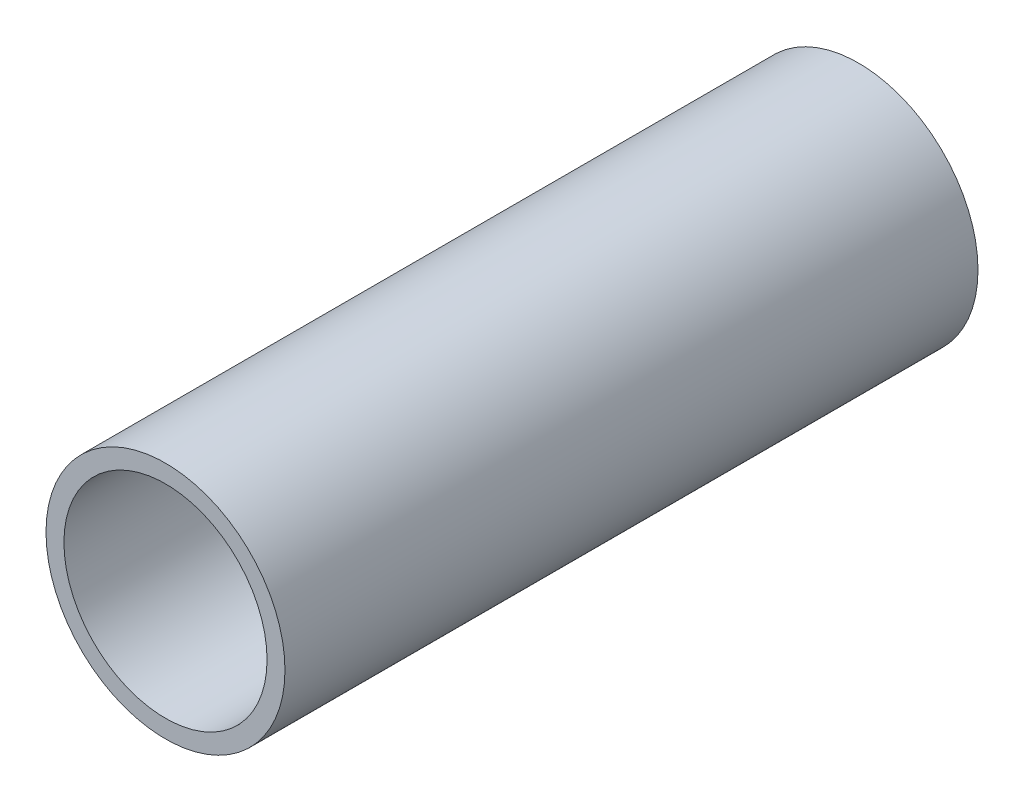
ISO-10303-21;
HEADER;
FILE_DESCRIPTION(('STEP AP214'),'2;1');
FILE_NAME('part.step','',(''),(''),'','','');
FILE_SCHEMA(('AUTOMOTIVE_DESIGN { 1 0 10303 214 1 1 1 1 }'));
ENDSEC;
DATA;
#1=APPLICATION_CONTEXT('core data for automotive mechanical design processes');
#2=APPLICATION_PROTOCOL_DEFINITION('international standard','automotive_design',2000,#1);
#3=PRODUCT_CONTEXT('',#1,'mechanical');
#4=PRODUCT('Part','Part','',(#3));
#5=PRODUCT_RELATED_PRODUCT_CATEGORY('part','',(#4));
#6=PRODUCT_DEFINITION_FORMATION('','',#4);
#7=PRODUCT_DEFINITION_CONTEXT('part definition',#1,'design');
#8=PRODUCT_DEFINITION('design','',#6,#7);
#9=PRODUCT_DEFINITION_SHAPE('','',#8);
#10=(LENGTH_UNIT() NAMED_UNIT(*) SI_UNIT(.MILLI.,.METRE.));
#11=(NAMED_UNIT(*) PLANE_ANGLE_UNIT() SI_UNIT($,.RADIAN.));
#12=(NAMED_UNIT(*) SI_UNIT($,.STERADIAN.) SOLID_ANGLE_UNIT());
#13=UNCERTAINTY_MEASURE_WITH_UNIT(LENGTH_MEASURE(1.E-05),#10,'distance_accuracy_value','');
#14=(GEOMETRIC_REPRESENTATION_CONTEXT(3) GLOBAL_UNCERTAINTY_ASSIGNED_CONTEXT((#13)) GLOBAL_UNIT_ASSIGNED_CONTEXT((#10,
#11,#12)) REPRESENTATION_CONTEXT('',''));
#15=CARTESIAN_POINT('',(0.,0.,0.));
#16=DIRECTION('',(0.,0.,1.));
#17=DIRECTION('',(1.,0.,0.));
#18=AXIS2_PLACEMENT_3D('',#15,#16,#17);
#19=CARTESIAN_POINT('',(0.,0.,58.));
#20=DIRECTION('',(0.,0.,1.));
#21=DIRECTION('',(1.,0.,0.));
#22=AXIS2_PLACEMENT_3D('',#19,#20,#21);
#23=PLANE('',#22);
#24=CARTESIAN_POINT('',(0.,0.,58.));
#25=DIRECTION('',(0.,0.,1.));
#26=DIRECTION('',(1.,0.,0.));
#27=AXIS2_PLACEMENT_3D('',#24,#25,#26);
#28=CIRCLE('',#27,10.);
#29=CARTESIAN_POINT('',(-10.,0.,58.));
#30=VERTEX_POINT('',#29);
#31=EDGE_CURVE('E10',#30,#30,#28,.T.);
#32=ORIENTED_EDGE('',*,*,#31,.T.);
#33=EDGE_LOOP('',(#32));
#34=FACE_BOUND('',#33,.T.);
#35=CARTESIAN_POINT('',(0.,0.,58.));
#36=DIRECTION('',(0.,0.,1.));
#37=DIRECTION('',(1.,0.,0.));
#38=AXIS2_PLACEMENT_3D('',#35,#36,#37);
#39=CIRCLE('',#38,8.5);
#40=CARTESIAN_POINT('',(-8.5,0.,58.));
#41=VERTEX_POINT('',#40);
#42=EDGE_CURVE('E50',#41,#41,#39,.T.);
#43=ORIENTED_EDGE('',*,*,#42,.F.);
#44=EDGE_LOOP('',(#43));
#45=FACE_BOUND('',#44,.T.);
#46=ADVANCED_FACE('F37',(#34,#45),#23,.T.);
#47=CARTESIAN_POINT('',(0.,0.,0.));
#48=DIRECTION('',(0.,0.,1.));
#49=DIRECTION('',(1.,0.,0.));
#50=AXIS2_PLACEMENT_3D('',#47,#48,#49);
#51=PLANE('',#50);
#52=CARTESIAN_POINT('',(0.,0.,0.));
#53=DIRECTION('',(0.,0.,1.));
#54=DIRECTION('',(1.,0.,0.));
#55=AXIS2_PLACEMENT_3D('',#52,#53,#54);
#56=CIRCLE('',#55,10.);
#57=CARTESIAN_POINT('',(-10.,0.,0.));
#58=VERTEX_POINT('',#57);
#59=EDGE_CURVE('E41',#58,#58,#56,.T.);
#60=ORIENTED_EDGE('',*,*,#59,.F.);
#61=EDGE_LOOP('',(#60));
#62=FACE_BOUND('',#61,.T.);
#63=CARTESIAN_POINT('',(0.,0.,0.));
#64=DIRECTION('',(0.,0.,1.));
#65=DIRECTION('',(1.,0.,0.));
#66=AXIS2_PLACEMENT_3D('',#63,#64,#65);
#67=CIRCLE('',#66,8.5);
#68=CARTESIAN_POINT('',(-8.5,0.,0.));
#69=VERTEX_POINT('',#68);
#70=EDGE_CURVE('E52',#69,#69,#67,.T.);
#71=ORIENTED_EDGE('',*,*,#70,.T.);
#72=EDGE_LOOP('',(#71));
#73=FACE_BOUND('',#72,.T.);
#74=ADVANCED_FACE('F64',(#62,#73),#51,.F.);
#75=CARTESIAN_POINT('',(0.,0.,58.));
#76=DIRECTION('',(0.,0.,-1.));
#77=DIRECTION('',(-1.,0.,0.));
#78=AXIS2_PLACEMENT_3D('',#75,#76,#77);
#79=CYLINDRICAL_SURFACE('',#78,10.);
#80=CARTESIAN_POINT('',(-10.,0.,58.));
#81=CARTESIAN_POINT('',(-10.,0.,57.3958333333333));
#82=CARTESIAN_POINT('',(-10.,0.,56.7916666666667));
#83=CARTESIAN_POINT('',(-10.,0.,55.5833333333333));
#84=CARTESIAN_POINT('',(-10.,0.,54.9791666666667));
#85=CARTESIAN_POINT('',(-10.,0.,53.7708333333333));
#86=CARTESIAN_POINT('',(-10.,0.,53.1666666666667));
#87=CARTESIAN_POINT('',(-10.,0.,51.9583333333333));
#88=CARTESIAN_POINT('',(-10.,0.,51.3541666666667));
#89=CARTESIAN_POINT('',(-10.,0.,50.1458333333333));
#90=CARTESIAN_POINT('',(-10.,0.,49.5416666666667));
#91=CARTESIAN_POINT('',(-10.,0.,48.3333333333333));
#92=CARTESIAN_POINT('',(-10.,0.,47.7291666666667));
#93=CARTESIAN_POINT('',(-10.,0.,46.5208333333333));
#94=CARTESIAN_POINT('',(-10.,0.,45.9166666666667));
#95=CARTESIAN_POINT('',(-10.,0.,44.7083333333333));
#96=CARTESIAN_POINT('',(-10.,0.,44.1041666666667));
#97=CARTESIAN_POINT('',(-10.,0.,42.8958333333333));
#98=CARTESIAN_POINT('',(-10.,0.,42.2916666666667));
#99=CARTESIAN_POINT('',(-10.,0.,41.0833333333333));
#100=CARTESIAN_POINT('',(-10.,0.,40.4791666666667));
#101=CARTESIAN_POINT('',(-10.,0.,39.2708333333333));
#102=CARTESIAN_POINT('',(-10.,0.,38.6666666666667));
#103=CARTESIAN_POINT('',(-10.,0.,37.4583333333333));
#104=CARTESIAN_POINT('',(-10.,0.,36.8541666666667));
#105=CARTESIAN_POINT('',(-10.,0.,35.6458333333333));
#106=CARTESIAN_POINT('',(-10.,0.,35.0416666666667));
#107=CARTESIAN_POINT('',(-10.,0.,33.8333333333333));
#108=CARTESIAN_POINT('',(-10.,0.,33.2291666666667));
#109=CARTESIAN_POINT('',(-10.,0.,32.0208333333333));
#110=CARTESIAN_POINT('',(-10.,0.,31.4166666666667));
#111=CARTESIAN_POINT('',(-10.,0.,30.2083333333333));
#112=CARTESIAN_POINT('',(-10.,0.,29.6041666666667));
#113=CARTESIAN_POINT('',(-10.,0.,28.3958333333333));
#114=CARTESIAN_POINT('',(-10.,0.,27.7916666666667));
#115=CARTESIAN_POINT('',(-10.,0.,26.5833333333333));
#116=CARTESIAN_POINT('',(-10.,0.,25.9791666666667));
#117=CARTESIAN_POINT('',(-10.,0.,24.7708333333333));
#118=CARTESIAN_POINT('',(-10.,0.,24.1666666666667));
#119=CARTESIAN_POINT('',(-10.,0.,22.9583333333333));
#120=CARTESIAN_POINT('',(-10.,0.,22.3541666666667));
#121=CARTESIAN_POINT('',(-10.,0.,21.1458333333333));
#122=CARTESIAN_POINT('',(-10.,0.,20.5416666666667));
#123=CARTESIAN_POINT('',(-10.,0.,19.3333333333333));
#124=CARTESIAN_POINT('',(-10.,0.,18.7291666666667));
#125=CARTESIAN_POINT('',(-10.,0.,17.5208333333333));
#126=CARTESIAN_POINT('',(-10.,0.,16.9166666666667));
#127=CARTESIAN_POINT('',(-10.,0.,15.7083333333333));
#128=CARTESIAN_POINT('',(-10.,0.,15.1041666666667));
#129=CARTESIAN_POINT('',(-10.,0.,13.8958333333333));
#130=CARTESIAN_POINT('',(-10.,0.,13.2916666666667));
#131=CARTESIAN_POINT('',(-10.,0.,12.0833333333333));
#132=CARTESIAN_POINT('',(-10.,0.,11.4791666666667));
#133=CARTESIAN_POINT('',(-10.,0.,10.2708333333333));
#134=CARTESIAN_POINT('',(-10.,0.,9.66666666666667));
#135=CARTESIAN_POINT('',(-10.,0.,8.45833333333333));
#136=CARTESIAN_POINT('',(-10.,0.,7.85416666666667));
#137=CARTESIAN_POINT('',(-10.,0.,6.64583333333333));
#138=CARTESIAN_POINT('',(-10.,0.,6.04166666666667));
#139=CARTESIAN_POINT('',(-10.,0.,4.83333333333333));
#140=CARTESIAN_POINT('',(-10.,0.,4.22916666666667));
#141=CARTESIAN_POINT('',(-10.,0.,3.02083333333334));
#142=CARTESIAN_POINT('',(-10.,0.,2.41666666666667));
#143=CARTESIAN_POINT('',(-10.,0.,1.20833333333333));
#144=CARTESIAN_POINT('',(-10.,0.,0.604166666666666));
#145=CARTESIAN_POINT('',(-10.,0.,0.));
#146=B_SPLINE_CURVE_WITH_KNOTS('',3,(#80,#81,#82,#83,#84,#85,#86,#87,#88,#89,#90,#91,#92,#93,
#94,#95,#96,#97,#98,#99,#100,#101,#102,#103,#104,#105,#106,#107,#108,#109,#110,#111,#112,#113,
#114,#115,#116,#117,#118,#119,#120,#121,#122,#123,#124,#125,#126,#127,#128,#129,#130,#131,#132,
#133,#134,#135,#136,#137,#138,#139,#140,#141,#142,#143,#144,#145),.UNSPECIFIED.,.F.,.F.,(4,2,2,
2,2,2,2,2,2,2,2,2,2,2,2,2,2,2,2,2,2,2,2,2,2,2,2,2,2,2,2,2,4),(0.,1.81249999999999,3.625,5.4375,
7.24999999999999,9.06249999999999,10.875,12.6875,14.5,16.3125,18.125,19.9375,21.75,23.5625,
25.375,27.1875,29.,30.8125,32.625,34.4375,36.25,38.0625,39.875,41.6875,43.5,45.3125,47.125,
48.9375,50.75,52.5625,54.375,56.1875,58.),.UNSPECIFIED.);
#147=EDGE_CURVE('BSEAM39',#30,#58,#146,.T.);
#148=ORIENTED_EDGE('',*,*,#31,.F.);
#149=ORIENTED_EDGE('',*,*,#59,.T.);
#150=ORIENTED_EDGE('',*,*,#147,.T.);
#151=ORIENTED_EDGE('',*,*,#147,.F.);
#152=EDGE_LOOP('',(#148,#150,#149,#151));
#153=FACE_BOUND('',#152,.T.);
#154=ADVANCED_FACE('F39',(#153),#79,.T.);
#155=CARTESIAN_POINT('',(0.,0.,58.));
#156=DIRECTION('',(0.,0.,-1.));
#157=DIRECTION('',(-1.,0.,0.));
#158=AXIS2_PLACEMENT_3D('',#155,#156,#157);
#159=CYLINDRICAL_SURFACE('',#158,8.5);
#160=CARTESIAN_POINT('',(-8.5,0.,58.));
#161=CARTESIAN_POINT('',(-8.5,0.,57.3958333333333));
#162=CARTESIAN_POINT('',(-8.5,0.,56.7916666666667));
#163=CARTESIAN_POINT('',(-8.5,0.,55.5833333333333));
#164=CARTESIAN_POINT('',(-8.5,0.,54.9791666666667));
#165=CARTESIAN_POINT('',(-8.5,0.,53.7708333333333));
#166=CARTESIAN_POINT('',(-8.5,0.,53.1666666666667));
#167=CARTESIAN_POINT('',(-8.5,0.,51.9583333333333));
#168=CARTESIAN_POINT('',(-8.5,0.,51.3541666666667));
#169=CARTESIAN_POINT('',(-8.5,0.,50.1458333333333));
#170=CARTESIAN_POINT('',(-8.5,0.,49.5416666666667));
#171=CARTESIAN_POINT('',(-8.5,0.,48.3333333333333));
#172=CARTESIAN_POINT('',(-8.5,0.,47.7291666666667));
#173=CARTESIAN_POINT('',(-8.5,0.,46.5208333333333));
#174=CARTESIAN_POINT('',(-8.5,0.,45.9166666666667));
#175=CARTESIAN_POINT('',(-8.5,0.,44.7083333333333));
#176=CARTESIAN_POINT('',(-8.5,0.,44.1041666666667));
#177=CARTESIAN_POINT('',(-8.5,0.,42.8958333333333));
#178=CARTESIAN_POINT('',(-8.5,0.,42.2916666666667));
#179=CARTESIAN_POINT('',(-8.5,0.,41.0833333333333));
#180=CARTESIAN_POINT('',(-8.5,0.,40.4791666666667));
#181=CARTESIAN_POINT('',(-8.5,0.,39.2708333333333));
#182=CARTESIAN_POINT('',(-8.5,0.,38.6666666666667));
#183=CARTESIAN_POINT('',(-8.5,0.,37.4583333333333));
#184=CARTESIAN_POINT('',(-8.5,0.,36.8541666666667));
#185=CARTESIAN_POINT('',(-8.5,0.,35.6458333333333));
#186=CARTESIAN_POINT('',(-8.5,0.,35.0416666666667));
#187=CARTESIAN_POINT('',(-8.5,0.,33.8333333333333));
#188=CARTESIAN_POINT('',(-8.5,0.,33.2291666666667));
#189=CARTESIAN_POINT('',(-8.5,0.,32.0208333333333));
#190=CARTESIAN_POINT('',(-8.5,0.,31.4166666666667));
#191=CARTESIAN_POINT('',(-8.5,0.,30.2083333333333));
#192=CARTESIAN_POINT('',(-8.5,0.,29.6041666666667));
#193=CARTESIAN_POINT('',(-8.5,0.,28.3958333333333));
#194=CARTESIAN_POINT('',(-8.5,0.,27.7916666666667));
#195=CARTESIAN_POINT('',(-8.5,0.,26.5833333333333));
#196=CARTESIAN_POINT('',(-8.5,0.,25.9791666666667));
#197=CARTESIAN_POINT('',(-8.5,0.,24.7708333333333));
#198=CARTESIAN_POINT('',(-8.5,0.,24.1666666666667));
#199=CARTESIAN_POINT('',(-8.5,0.,22.9583333333333));
#200=CARTESIAN_POINT('',(-8.5,0.,22.3541666666667));
#201=CARTESIAN_POINT('',(-8.5,0.,21.1458333333333));
#202=CARTESIAN_POINT('',(-8.5,0.,20.5416666666667));
#203=CARTESIAN_POINT('',(-8.5,0.,19.3333333333333));
#204=CARTESIAN_POINT('',(-8.5,0.,18.7291666666667));
#205=CARTESIAN_POINT('',(-8.5,0.,17.5208333333333));
#206=CARTESIAN_POINT('',(-8.5,0.,16.9166666666667));
#207=CARTESIAN_POINT('',(-8.5,0.,15.7083333333333));
#208=CARTESIAN_POINT('',(-8.5,0.,15.1041666666667));
#209=CARTESIAN_POINT('',(-8.5,0.,13.8958333333333));
#210=CARTESIAN_POINT('',(-8.5,0.,13.2916666666667));
#211=CARTESIAN_POINT('',(-8.5,0.,12.0833333333333));
#212=CARTESIAN_POINT('',(-8.5,0.,11.4791666666667));
#213=CARTESIAN_POINT('',(-8.5,0.,10.2708333333333));
#214=CARTESIAN_POINT('',(-8.5,0.,9.66666666666667));
#215=CARTESIAN_POINT('',(-8.5,0.,8.45833333333333));
#216=CARTESIAN_POINT('',(-8.5,0.,7.85416666666667));
#217=CARTESIAN_POINT('',(-8.5,0.,6.64583333333333));
#218=CARTESIAN_POINT('',(-8.5,0.,6.04166666666667));
#219=CARTESIAN_POINT('',(-8.5,0.,4.83333333333333));
#220=CARTESIAN_POINT('',(-8.5,0.,4.22916666666667));
#221=CARTESIAN_POINT('',(-8.5,0.,3.02083333333334));
#222=CARTESIAN_POINT('',(-8.5,0.,2.41666666666667));
#223=CARTESIAN_POINT('',(-8.5,0.,1.20833333333333));
#224=CARTESIAN_POINT('',(-8.5,0.,0.604166666666666));
#225=CARTESIAN_POINT('',(-8.5,0.,0.));
#226=B_SPLINE_CURVE_WITH_KNOTS('',3,(#160,#161,#162,#163,#164,#165,#166,#167,#168,#169,#170,
#171,#172,#173,#174,#175,#176,#177,#178,#179,#180,#181,#182,#183,#184,#185,#186,#187,#188,#189,
#190,#191,#192,#193,#194,#195,#196,#197,#198,#199,#200,#201,#202,#203,#204,#205,#206,#207,#208,
#209,#210,#211,#212,#213,#214,#215,#216,#217,#218,#219,#220,#221,#222,#223,#224,#225),
.UNSPECIFIED.,.F.,.F.,(4,2,2,2,2,2,2,2,2,2,2,2,2,2,2,2,2,2,2,2,2,2,2,2,2,2,2,2,2,2,2,2,4),(0.,
1.8125,3.625,5.4375,7.25000000000001,9.0625,10.875,12.6875,14.5,16.3125,18.125,19.9375,21.75,
23.5625,25.375,27.1875,29.,30.8125,32.625,34.4375,36.25,38.0625,39.875,41.6875,43.5,45.3125,
47.125,48.9375,50.75,52.5625,54.375,56.1875,58.),.UNSPECIFIED.);
#227=EDGE_CURVE('BSEAM60',#41,#69,#226,.T.);
#228=ORIENTED_EDGE('',*,*,#42,.T.);
#229=ORIENTED_EDGE('',*,*,#70,.F.);
#230=ORIENTED_EDGE('',*,*,#227,.T.);
#231=ORIENTED_EDGE('',*,*,#227,.F.);
#232=EDGE_LOOP('',(#228,#230,#229,#231));
#233=FACE_BOUND('',#232,.T.);
#234=ADVANCED_FACE('F60',(#233),#159,.F.);
#235=CLOSED_SHELL('',(#46,#74,#154,#234));
#236=MANIFOLD_SOLID_BREP('B2',#235);
#237=ADVANCED_BREP_SHAPE_REPRESENTATION('',(#18,#236),#14);
#238=SHAPE_DEFINITION_REPRESENTATION(#9,#237);
ENDSEC;
END-ISO-10303-21;
